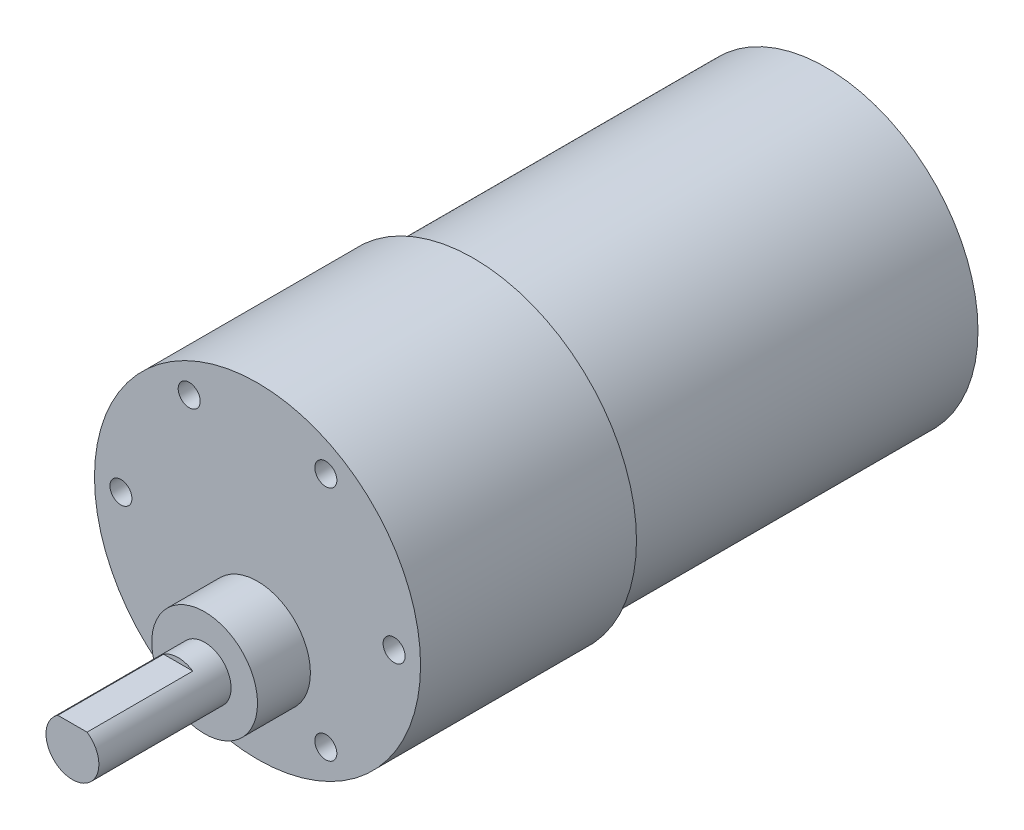
ISO-10303-21;
HEADER;
FILE_DESCRIPTION(('STEP AP214'),'2;1');
FILE_NAME('part.step','',(''),(''),'','','');
FILE_SCHEMA(('AUTOMOTIVE_DESIGN { 1 0 10303 214 1 1 1 1 }'));
ENDSEC;
DATA;
#1=APPLICATION_CONTEXT('core data for automotive mechanical design processes');
#2=APPLICATION_PROTOCOL_DEFINITION('international standard','automotive_design',2000,#1);
#3=PRODUCT_CONTEXT('',#1,'mechanical');
#4=PRODUCT('Part','Part','',(#3));
#5=PRODUCT_RELATED_PRODUCT_CATEGORY('part','',(#4));
#6=PRODUCT_DEFINITION_FORMATION('','',#4);
#7=PRODUCT_DEFINITION_CONTEXT('part definition',#1,'design');
#8=PRODUCT_DEFINITION('design','',#6,#7);
#9=PRODUCT_DEFINITION_SHAPE('','',#8);
#10=(LENGTH_UNIT() NAMED_UNIT(*) SI_UNIT(.MILLI.,.METRE.));
#11=(NAMED_UNIT(*) PLANE_ANGLE_UNIT() SI_UNIT($,.RADIAN.));
#12=(NAMED_UNIT(*) SI_UNIT($,.STERADIAN.) SOLID_ANGLE_UNIT());
#13=UNCERTAINTY_MEASURE_WITH_UNIT(LENGTH_MEASURE(1.E-05),#10,'distance_accuracy_value','');
#14=(GEOMETRIC_REPRESENTATION_CONTEXT(3) GLOBAL_UNCERTAINTY_ASSIGNED_CONTEXT((#13)) GLOBAL_UNIT_ASSIGNED_CONTEXT((#10,
#11,#12)) REPRESENTATION_CONTEXT('',''));
#15=CARTESIAN_POINT('',(0.,0.,0.));
#16=DIRECTION('',(0.,0.,1.));
#17=DIRECTION('',(1.,0.,0.));
#18=AXIS2_PLACEMENT_3D('',#15,#16,#17);
#19=CARTESIAN_POINT('',(0.,-7.,70.5));
#20=DIRECTION('',(0.,0.,1.));
#21=DIRECTION('',(1.,0.,0.));
#22=AXIS2_PLACEMENT_3D('',#19,#20,#21);
#23=PLANE('',#22);
#24=CARTESIAN_POINT('',(0.,-7.,70.5));
#25=DIRECTION('',(0.,0.,1.));
#26=DIRECTION('',(1.,0.,0.));
#27=AXIS2_PLACEMENT_3D('',#24,#25,#26);
#28=CIRCLE('',#27,6.);
#29=CARTESIAN_POINT('',(6.,-7.,70.5));
#30=VERTEX_POINT('',#29);
#31=EDGE_CURVE('E79',#30,#30,#28,.T.);
#32=ORIENTED_EDGE('',*,*,#31,.T.);
#33=EDGE_LOOP('',(#32));
#34=FACE_BOUND('',#33,.T.);
#35=CARTESIAN_POINT('',(0.,-7.,70.5));
#36=DIRECTION('',(0.,0.,1.));
#37=DIRECTION('',(1.,0.,0.));
#38=AXIS2_PLACEMENT_3D('',#35,#36,#37);
#39=CIRCLE('',#38,3.);
#40=CARTESIAN_POINT('',(3.,-7.,70.5));
#41=VERTEX_POINT('',#40);
#42=EDGE_CURVE('E76',#41,#41,#39,.T.);
#43=ORIENTED_EDGE('',*,*,#42,.F.);
#44=EDGE_LOOP('',(#43));
#45=FACE_BOUND('',#44,.T.);
#46=ADVANCED_FACE('F33',(#34,#45),#23,.T.);
#47=CARTESIAN_POINT('',(0.,0.,64.5));
#48=DIRECTION('',(0.,0.,1.));
#49=DIRECTION('',(1.,0.,0.));
#50=AXIS2_PLACEMENT_3D('',#47,#48,#49);
#51=PLANE('',#50);
#52=CARTESIAN_POINT('',(-7.75000000003913,-13.4233821174013,64.5));
#53=DIRECTION('',(0.,0.,1.));
#54=DIRECTION('',(1.,0.,0.));
#55=AXIS2_PLACEMENT_3D('',#52,#53,#54);
#56=CIRCLE('',#55,1.25000000000115);
#57=CARTESIAN_POINT('',(-6.50000000003798,-13.4233821174013,64.5));
#58=VERTEX_POINT('',#57);
#59=EDGE_CURVE('E332',#58,#58,#56,.T.);
#60=ORIENTED_EDGE('',*,*,#59,.F.);
#61=EDGE_LOOP('',(#60));
#62=FACE_BOUND('',#61,.T.);
#63=CARTESIAN_POINT('',(7.74999999996087,-13.4233821174013,64.5));
#64=DIRECTION('',(0.,0.,1.));
#65=DIRECTION('',(1.,0.,0.));
#66=AXIS2_PLACEMENT_3D('',#63,#64,#65);
#67=CIRCLE('',#66,1.25000000000114);
#68=CARTESIAN_POINT('',(8.99999999996202,-13.4233821174013,64.5));
#69=VERTEX_POINT('',#68);
#70=EDGE_CURVE('E331',#69,#69,#67,.T.);
#71=ORIENTED_EDGE('',*,*,#70,.F.);
#72=EDGE_LOOP('',(#71));
#73=FACE_BOUND('',#72,.T.);
#74=CARTESIAN_POINT('',(15.4999999999609,1.16412575138153E-05,64.5));
#75=DIRECTION('',(0.,0.,1.));
#76=DIRECTION('',(1.,0.,0.));
#77=AXIS2_PLACEMENT_3D('',#74,#75,#76);
#78=CIRCLE('',#77,1.25000000000115);
#79=CARTESIAN_POINT('',(16.749999999962,1.16412575138153E-05,64.5));
#80=VERTEX_POINT('',#79);
#81=EDGE_CURVE('E341',#80,#80,#78,.T.);
#82=ORIENTED_EDGE('',*,*,#81,.F.);
#83=EDGE_LOOP('',(#82));
#84=FACE_BOUND('',#83,.T.);
#85=CARTESIAN_POINT('',(7.74999999996086,13.4234053999163,64.5));
#86=DIRECTION('',(0.,0.,1.));
#87=DIRECTION('',(1.,0.,0.));
#88=AXIS2_PLACEMENT_3D('',#85,#86,#87);
#89=CIRCLE('',#88,1.25000000000115);
#90=CARTESIAN_POINT('',(8.99999999996201,13.4234053999163,64.5));
#91=VERTEX_POINT('',#90);
#92=EDGE_CURVE('E346',#91,#91,#89,.T.);
#93=ORIENTED_EDGE('',*,*,#92,.F.);
#94=EDGE_LOOP('',(#93));
#95=FACE_BOUND('',#94,.T.);
#96=CARTESIAN_POINT('',(-7.75000000003914,13.4234053999163,64.5));
#97=DIRECTION('',(0.,0.,1.));
#98=DIRECTION('',(1.,0.,0.));
#99=AXIS2_PLACEMENT_3D('',#96,#97,#98);
#100=CIRCLE('',#99,1.25000000000115);
#101=CARTESIAN_POINT('',(-6.50000000003799,13.4234053999163,64.5));
#102=VERTEX_POINT('',#101);
#103=EDGE_CURVE('E352',#102,#102,#100,.T.);
#104=ORIENTED_EDGE('',*,*,#103,.F.);
#105=EDGE_LOOP('',(#104));
#106=FACE_BOUND('',#105,.T.);
#107=CARTESIAN_POINT('',(-15.5000000000391,1.16412575118465E-05,64.5));
#108=DIRECTION('',(0.,0.,1.));
#109=DIRECTION('',(1.,0.,0.));
#110=AXIS2_PLACEMENT_3D('',#107,#108,#109);
#111=CIRCLE('',#110,1.25000000000115);
#112=CARTESIAN_POINT('',(-14.250000000038,1.16412575118465E-05,64.5));
#113=VERTEX_POINT('',#112);
#114=EDGE_CURVE('E358',#113,#113,#111,.T.);
#115=ORIENTED_EDGE('',*,*,#114,.F.);
#116=EDGE_LOOP('',(#115));
#117=FACE_BOUND('',#116,.T.);
#118=CARTESIAN_POINT('',(0.,0.,64.5));
#119=DIRECTION('',(0.,0.,1.));
#120=DIRECTION('',(1.,0.,0.));
#121=AXIS2_PLACEMENT_3D('',#118,#119,#120);
#122=CIRCLE('',#121,18.5);
#123=CARTESIAN_POINT('',(18.5,0.,64.5));
#124=VERTEX_POINT('',#123);
#125=EDGE_CURVE('E88',#124,#124,#122,.T.);
#126=ORIENTED_EDGE('',*,*,#125,.T.);
#127=EDGE_LOOP('',(#126));
#128=FACE_BOUND('',#127,.T.);
#129=CARTESIAN_POINT('',(0.,-7.,64.5));
#130=DIRECTION('',(0.,0.,1.));
#131=DIRECTION('',(1.,0.,0.));
#132=AXIS2_PLACEMENT_3D('',#129,#130,#131);
#133=CIRCLE('',#132,6.);
#134=CARTESIAN_POINT('',(6.,-7.,64.5));
#135=VERTEX_POINT('',#134);
#136=EDGE_CURVE('E75',#135,#135,#133,.T.);
#137=ORIENTED_EDGE('',*,*,#136,.F.);
#138=EDGE_LOOP('',(#137));
#139=FACE_BOUND('',#138,.T.);
#140=ADVANCED_FACE('F105',(#62,#73,#84,#95,#106,#117,#128,#139),#51,.T.);
#141=CARTESIAN_POINT('',(0.,0.,40.));
#142=DIRECTION('',(0.,0.,-1.));
#143=DIRECTION('',(-1.,0.,0.));
#144=AXIS2_PLACEMENT_3D('',#141,#142,#143);
#145=CYLINDRICAL_SURFACE('',#144,17.25);
#146=CARTESIAN_POINT('',(0.,0.,40.));
#147=DIRECTION('',(0.,0.,1.));
#148=DIRECTION('',(1.,0.,0.));
#149=AXIS2_PLACEMENT_3D('',#146,#147,#148);
#150=CIRCLE('',#149,17.25);
#151=CARTESIAN_POINT('',(17.25,0.,40.));
#152=VERTEX_POINT('',#151);
#153=EDGE_CURVE('E11',#152,#152,#150,.T.);
#154=ORIENTED_EDGE('',*,*,#153,.F.);
#155=EDGE_LOOP('',(#154));
#156=FACE_BOUND('',#155,.T.);
#157=CARTESIAN_POINT('',(0.,0.,0.));
#158=DIRECTION('',(0.,0.,1.));
#159=DIRECTION('',(1.,0.,0.));
#160=AXIS2_PLACEMENT_3D('',#157,#158,#159);
#161=CIRCLE('',#160,17.25);
#162=CARTESIAN_POINT('',(17.25,0.,0.));
#163=VERTEX_POINT('',#162);
#164=EDGE_CURVE('E37',#163,#163,#161,.T.);
#165=ORIENTED_EDGE('',*,*,#164,.T.);
#166=EDGE_LOOP('',(#165));
#167=FACE_BOUND('',#166,.T.);
#168=ADVANCED_FACE('F35',(#156,#167),#145,.T.);
#169=CARTESIAN_POINT('',(0.,0.,0.));
#170=DIRECTION('',(0.,0.,1.));
#171=DIRECTION('',(1.,0.,0.));
#172=AXIS2_PLACEMENT_3D('',#169,#170,#171);
#173=PLANE('',#172);
#174=ORIENTED_EDGE('',*,*,#164,.F.);
#175=EDGE_LOOP('',(#174));
#176=FACE_BOUND('',#175,.T.);
#177=ADVANCED_FACE('F99',(#176),#173,.F.);
#178=CARTESIAN_POINT('',(0.,0.,40.));
#179=DIRECTION('',(0.,0.,1.));
#180=DIRECTION('',(1.,0.,0.));
#181=AXIS2_PLACEMENT_3D('',#178,#179,#180);
#182=PLANE('',#181);
#183=CARTESIAN_POINT('',(0.,0.,40.));
#184=DIRECTION('',(0.,0.,1.));
#185=DIRECTION('',(1.,0.,0.));
#186=AXIS2_PLACEMENT_3D('',#183,#184,#185);
#187=CIRCLE('',#186,18.5);
#188=CARTESIAN_POINT('',(18.5,0.,40.));
#189=VERTEX_POINT('',#188);
#190=EDGE_CURVE('E86',#189,#189,#187,.T.);
#191=ORIENTED_EDGE('',*,*,#190,.F.);
#192=EDGE_LOOP('',(#191));
#193=FACE_BOUND('',#192,.T.);
#194=ORIENTED_EDGE('',*,*,#153,.T.);
#195=EDGE_LOOP('',(#194));
#196=FACE_BOUND('',#195,.T.);
#197=ADVANCED_FACE('F96',(#193,#196),#182,.F.);
#198=CARTESIAN_POINT('',(0.,0.,64.5));
#199=DIRECTION('',(0.,0.,-1.));
#200=DIRECTION('',(-1.,0.,0.));
#201=AXIS2_PLACEMENT_3D('',#198,#199,#200);
#202=CYLINDRICAL_SURFACE('',#201,18.5);
#203=ORIENTED_EDGE('',*,*,#125,.F.);
#204=EDGE_LOOP('',(#203));
#205=FACE_BOUND('',#204,.T.);
#206=ORIENTED_EDGE('',*,*,#190,.T.);
#207=EDGE_LOOP('',(#206));
#208=FACE_BOUND('',#207,.T.);
#209=ADVANCED_FACE('F94',(#205,#208),#202,.T.);
#210=CARTESIAN_POINT('',(0.,-7.,70.5));
#211=DIRECTION('',(0.,0.,-1.));
#212=DIRECTION('',(-1.,0.,0.));
#213=AXIS2_PLACEMENT_3D('',#210,#211,#212);
#214=CYLINDRICAL_SURFACE('',#213,6.);
#215=ORIENTED_EDGE('',*,*,#31,.F.);
#216=EDGE_LOOP('',(#215));
#217=FACE_BOUND('',#216,.T.);
#218=ORIENTED_EDGE('',*,*,#136,.T.);
#219=EDGE_LOOP('',(#218));
#220=FACE_BOUND('',#219,.T.);
#221=ADVANCED_FACE('F126',(#217,#220),#214,.T.);
#222=CARTESIAN_POINT('',(0.,-7.,85.5));
#223=DIRECTION('',(0.,0.,-1.));
#224=DIRECTION('',(-1.,0.,0.));
#225=AXIS2_PLACEMENT_3D('',#222,#223,#224);
#226=CYLINDRICAL_SURFACE('',#225,3.);
#227=CARTESIAN_POINT('',(0.,-7.,85.5));
#228=DIRECTION('',(0.,0.,1.));
#229=DIRECTION('',(1.,0.,0.));
#230=AXIS2_PLACEMENT_3D('',#227,#228,#229);
#231=CIRCLE('',#230,3.);
#232=CARTESIAN_POINT('',(-1.6583123951777,-4.5,85.5));
#233=VERTEX_POINT('',#232);
#234=CARTESIAN_POINT('',(1.6583123951777,-4.5,85.5));
#235=VERTEX_POINT('',#234);
#236=EDGE_CURVE('E71',#233,#235,#231,.T.);
#237=ORIENTED_EDGE('',*,*,#236,.F.);
#238=DIRECTION('',(0.,0.,1.));
#239=VECTOR('',#238,1.);
#240=CARTESIAN_POINT('',(-1.6583123951777,-4.5,73.5));
#241=LINE('',#240,#239);
#242=CARTESIAN_POINT('',(-1.6583123951777,-4.5,73.5));
#243=VERTEX_POINT('',#242);
#244=EDGE_CURVE('E48',#243,#233,#241,.T.);
#245=ORIENTED_EDGE('',*,*,#244,.F.);
#246=CARTESIAN_POINT('',(0.,-7.,73.5));
#247=DIRECTION('',(0.,0.,1.));
#248=DIRECTION('',(1.,0.,0.));
#249=AXIS2_PLACEMENT_3D('',#246,#247,#248);
#250=CIRCLE('',#249,3.);
#251=CARTESIAN_POINT('',(1.6583123951777,-4.5,73.5));
#252=VERTEX_POINT('',#251);
#253=EDGE_CURVE('E72',#252,#243,#250,.T.);
#254=ORIENTED_EDGE('',*,*,#253,.F.);
#255=DIRECTION('',(0.,0.,1.));
#256=VECTOR('',#255,1.);
#257=CARTESIAN_POINT('',(1.6583123951777,-4.5,73.5));
#258=LINE('',#257,#256);
#259=EDGE_CURVE('E61',#252,#235,#258,.T.);
#260=ORIENTED_EDGE('',*,*,#259,.T.);
#261=EDGE_LOOP('',(#237,#245,#254,#260));
#262=FACE_BOUND('',#261,.T.);
#263=ORIENTED_EDGE('',*,*,#42,.T.);
#264=EDGE_LOOP('',(#263));
#265=FACE_BOUND('',#264,.T.);
#266=ADVANCED_FACE('F69',(#262,#265),#226,.T.);
#267=CARTESIAN_POINT('',(0.,-7.,85.5));
#268=DIRECTION('',(0.,0.,1.));
#269=DIRECTION('',(1.,0.,0.));
#270=AXIS2_PLACEMENT_3D('',#267,#268,#269);
#271=PLANE('',#270);
#272=DIRECTION('',(1.,0.,0.));
#273=VECTOR('',#272,1.);
#274=CARTESIAN_POINT('',(0.,-4.5,85.5));
#275=LINE('',#274,#273);
#276=EDGE_CURVE('E58',#233,#235,#275,.T.);
#277=ORIENTED_EDGE('',*,*,#276,.F.);
#278=ORIENTED_EDGE('',*,*,#236,.T.);
#279=EDGE_LOOP('',(#277,#278));
#280=FACE_BOUND('',#279,.T.);
#281=ADVANCED_FACE('F74',(#280),#271,.T.);
#282=CARTESIAN_POINT('',(0.,-4.5,73.5));
#283=DIRECTION('',(0.,-1.,0.));
#284=DIRECTION('',(0.,0.,-1.));
#285=AXIS2_PLACEMENT_3D('',#282,#283,#284);
#286=PLANE('',#285);
#287=ORIENTED_EDGE('',*,*,#276,.T.);
#288=ORIENTED_EDGE('',*,*,#259,.F.);
#289=DIRECTION('',(1.,0.,0.));
#290=VECTOR('',#289,1.);
#291=CARTESIAN_POINT('',(0.,-4.5,73.5));
#292=LINE('',#291,#290);
#293=EDGE_CURVE('E54',#243,#252,#292,.T.);
#294=ORIENTED_EDGE('',*,*,#293,.F.);
#295=ORIENTED_EDGE('',*,*,#244,.T.);
#296=EDGE_LOOP('',(#287,#288,#294,#295));
#297=FACE_BOUND('',#296,.T.);
#298=ADVANCED_FACE('F60',(#297),#286,.F.);
#299=CARTESIAN_POINT('',(0.,-7.,73.5));
#300=DIRECTION('',(0.,0.,1.));
#301=DIRECTION('',(1.,0.,0.));
#302=AXIS2_PLACEMENT_3D('',#299,#300,#301);
#303=PLANE('',#302);
#304=ORIENTED_EDGE('',*,*,#293,.T.);
#305=ORIENTED_EDGE('',*,*,#253,.T.);
#306=EDGE_LOOP('',(#304,#305));
#307=FACE_BOUND('',#306,.T.);
#308=ADVANCED_FACE('F160',(#307),#303,.T.);
#309=CARTESIAN_POINT('',(-15.5000000000391,1.16412575118465E-05,59.5));
#310=DIRECTION('',(0.,0.,1.));
#311=DIRECTION('',(1.,0.,0.));
#312=AXIS2_PLACEMENT_3D('',#309,#310,#311);
#313=CYLINDRICAL_SURFACE('',#312,1.25000000000115);
#314=CARTESIAN_POINT('',(-15.5000000000391,1.16412575118465E-05,59.5));
#315=DIRECTION('',(0.,0.,1.));
#316=DIRECTION('',(1.,0.,0.));
#317=AXIS2_PLACEMENT_3D('',#314,#315,#316);
#318=CIRCLE('',#317,1.25000000000115);
#319=CARTESIAN_POINT('',(-14.250000000038,1.16412575118465E-05,59.5));
#320=VERTEX_POINT('',#319);
#321=EDGE_CURVE('E66',#320,#320,#318,.T.);
#322=ORIENTED_EDGE('',*,*,#321,.F.);
#323=EDGE_LOOP('',(#322));
#324=FACE_BOUND('',#323,.T.);
#325=ORIENTED_EDGE('',*,*,#114,.T.);
#326=EDGE_LOOP('',(#325));
#327=FACE_BOUND('',#326,.T.);
#328=ADVANCED_FACE('F167',(#324,#327),#313,.F.);
#329=CARTESIAN_POINT('',(-15.5000000000391,1.16412575118465E-05,59.5));
#330=DIRECTION('',(0.,0.,1.));
#331=DIRECTION('',(1.,0.,0.));
#332=AXIS2_PLACEMENT_3D('',#329,#330,#331);
#333=PLANE('',#332);
#334=ORIENTED_EDGE('',*,*,#321,.T.);
#335=EDGE_LOOP('',(#334));
#336=FACE_BOUND('',#335,.T.);
#337=ADVANCED_FACE('F175',(#336),#333,.T.);
#338=CARTESIAN_POINT('',(-7.75000000003914,13.4234053999163,59.5));
#339=DIRECTION('',(0.,0.,1.));
#340=DIRECTION('',(1.,0.,0.));
#341=AXIS2_PLACEMENT_3D('',#338,#339,#340);
#342=CYLINDRICAL_SURFACE('',#341,1.25000000000115);
#343=CARTESIAN_POINT('',(-7.75000000003914,13.4234053999163,59.5));
#344=DIRECTION('',(0.,0.,1.));
#345=DIRECTION('',(1.,0.,0.));
#346=AXIS2_PLACEMENT_3D('',#343,#344,#345);
#347=CIRCLE('',#346,1.25000000000115);
#348=CARTESIAN_POINT('',(-6.50000000003799,13.4234053999163,59.5));
#349=VERTEX_POINT('',#348);
#350=EDGE_CURVE('E355',#349,#349,#347,.T.);
#351=ORIENTED_EDGE('',*,*,#350,.F.);
#352=EDGE_LOOP('',(#351));
#353=FACE_BOUND('',#352,.T.);
#354=ORIENTED_EDGE('',*,*,#103,.T.);
#355=EDGE_LOOP('',(#354));
#356=FACE_BOUND('',#355,.T.);
#357=ADVANCED_FACE('F183',(#353,#356),#342,.F.);
#358=CARTESIAN_POINT('',(-7.75000000003914,13.4234053999163,59.5));
#359=DIRECTION('',(0.,0.,1.));
#360=DIRECTION('',(1.,0.,0.));
#361=AXIS2_PLACEMENT_3D('',#358,#359,#360);
#362=PLANE('',#361);
#363=ORIENTED_EDGE('',*,*,#350,.T.);
#364=EDGE_LOOP('',(#363));
#365=FACE_BOUND('',#364,.T.);
#366=ADVANCED_FACE('F191',(#365),#362,.T.);
#367=CARTESIAN_POINT('',(7.74999999996086,13.4234053999163,59.5));
#368=DIRECTION('',(0.,0.,1.));
#369=DIRECTION('',(1.,0.,0.));
#370=AXIS2_PLACEMENT_3D('',#367,#368,#369);
#371=CYLINDRICAL_SURFACE('',#370,1.25000000000115);
#372=CARTESIAN_POINT('',(7.74999999996086,13.4234053999163,59.5));
#373=DIRECTION('',(0.,0.,1.));
#374=DIRECTION('',(1.,0.,0.));
#375=AXIS2_PLACEMENT_3D('',#372,#373,#374);
#376=CIRCLE('',#375,1.25000000000115);
#377=CARTESIAN_POINT('',(8.99999999996201,13.4234053999163,59.5));
#378=VERTEX_POINT('',#377);
#379=EDGE_CURVE('E349',#378,#378,#376,.T.);
#380=ORIENTED_EDGE('',*,*,#379,.F.);
#381=EDGE_LOOP('',(#380));
#382=FACE_BOUND('',#381,.T.);
#383=ORIENTED_EDGE('',*,*,#92,.T.);
#384=EDGE_LOOP('',(#383));
#385=FACE_BOUND('',#384,.T.);
#386=ADVANCED_FACE('F199',(#382,#385),#371,.F.);
#387=CARTESIAN_POINT('',(7.74999999996086,13.4234053999163,59.5));
#388=DIRECTION('',(0.,0.,1.));
#389=DIRECTION('',(1.,0.,0.));
#390=AXIS2_PLACEMENT_3D('',#387,#388,#389);
#391=PLANE('',#390);
#392=ORIENTED_EDGE('',*,*,#379,.T.);
#393=EDGE_LOOP('',(#392));
#394=FACE_BOUND('',#393,.T.);
#395=ADVANCED_FACE('F207',(#394),#391,.T.);
#396=CARTESIAN_POINT('',(15.4999999999609,1.16412575138153E-05,59.5));
#397=DIRECTION('',(0.,0.,1.));
#398=DIRECTION('',(1.,0.,0.));
#399=AXIS2_PLACEMENT_3D('',#396,#397,#398);
#400=CYLINDRICAL_SURFACE('',#399,1.25000000000115);
#401=CARTESIAN_POINT('',(15.4999999999609,1.16412575138153E-05,59.5));
#402=DIRECTION('',(0.,0.,1.));
#403=DIRECTION('',(1.,0.,0.));
#404=AXIS2_PLACEMENT_3D('',#401,#402,#403);
#405=CIRCLE('',#404,1.25000000000115);
#406=CARTESIAN_POINT('',(16.749999999962,1.16412575138153E-05,59.5));
#407=VERTEX_POINT('',#406);
#408=EDGE_CURVE('E343',#407,#407,#405,.T.);
#409=ORIENTED_EDGE('',*,*,#408,.F.);
#410=EDGE_LOOP('',(#409));
#411=FACE_BOUND('',#410,.T.);
#412=ORIENTED_EDGE('',*,*,#81,.T.);
#413=EDGE_LOOP('',(#412));
#414=FACE_BOUND('',#413,.T.);
#415=ADVANCED_FACE('F215',(#411,#414),#400,.F.);
#416=CARTESIAN_POINT('',(15.4999999999609,1.16412575138153E-05,59.5));
#417=DIRECTION('',(0.,0.,1.));
#418=DIRECTION('',(1.,0.,0.));
#419=AXIS2_PLACEMENT_3D('',#416,#417,#418);
#420=PLANE('',#419);
#421=ORIENTED_EDGE('',*,*,#408,.T.);
#422=EDGE_LOOP('',(#421));
#423=FACE_BOUND('',#422,.T.);
#424=ADVANCED_FACE('F223',(#423),#420,.T.);
#425=CARTESIAN_POINT('',(7.74999999996087,-13.4233821174013,59.5));
#426=DIRECTION('',(0.,0.,1.));
#427=DIRECTION('',(1.,0.,0.));
#428=AXIS2_PLACEMENT_3D('',#425,#426,#427);
#429=CYLINDRICAL_SURFACE('',#428,1.25000000000114);
#430=CARTESIAN_POINT('',(7.74999999996087,-13.4233821174013,59.5));
#431=DIRECTION('',(0.,0.,1.));
#432=DIRECTION('',(1.,0.,0.));
#433=AXIS2_PLACEMENT_3D('',#430,#431,#432);
#434=CIRCLE('',#433,1.25000000000114);
#435=CARTESIAN_POINT('',(8.99999999996202,-13.4233821174013,59.5));
#436=VERTEX_POINT('',#435);
#437=EDGE_CURVE('E335',#436,#436,#434,.T.);
#438=ORIENTED_EDGE('',*,*,#437,.F.);
#439=EDGE_LOOP('',(#438));
#440=FACE_BOUND('',#439,.T.);
#441=ORIENTED_EDGE('',*,*,#70,.T.);
#442=EDGE_LOOP('',(#441));
#443=FACE_BOUND('',#442,.T.);
#444=ADVANCED_FACE('F231',(#440,#443),#429,.F.);
#445=CARTESIAN_POINT('',(7.74999999996087,-13.4233821174013,59.5));
#446=DIRECTION('',(0.,0.,1.));
#447=DIRECTION('',(1.,0.,0.));
#448=AXIS2_PLACEMENT_3D('',#445,#446,#447);
#449=PLANE('',#448);
#450=ORIENTED_EDGE('',*,*,#437,.T.);
#451=EDGE_LOOP('',(#450));
#452=FACE_BOUND('',#451,.T.);
#453=ADVANCED_FACE('F239',(#452),#449,.T.);
#454=CARTESIAN_POINT('',(-7.75000000003913,-13.4233821174013,59.5));
#455=DIRECTION('',(0.,0.,1.));
#456=DIRECTION('',(1.,0.,0.));
#457=AXIS2_PLACEMENT_3D('',#454,#455,#456);
#458=CYLINDRICAL_SURFACE('',#457,1.25000000000115);
#459=CARTESIAN_POINT('',(-7.75000000003913,-13.4233821174013,59.5));
#460=DIRECTION('',(0.,0.,1.));
#461=DIRECTION('',(1.,0.,0.));
#462=AXIS2_PLACEMENT_3D('',#459,#460,#461);
#463=CIRCLE('',#462,1.25000000000115);
#464=CARTESIAN_POINT('',(-6.50000000003798,-13.4233821174013,59.5));
#465=VERTEX_POINT('',#464);
#466=EDGE_CURVE('E330',#465,#465,#463,.T.);
#467=ORIENTED_EDGE('',*,*,#466,.F.);
#468=EDGE_LOOP('',(#467));
#469=FACE_BOUND('',#468,.T.);
#470=ORIENTED_EDGE('',*,*,#59,.T.);
#471=EDGE_LOOP('',(#470));
#472=FACE_BOUND('',#471,.T.);
#473=ADVANCED_FACE('F247',(#469,#472),#458,.F.);
#474=CARTESIAN_POINT('',(-7.75000000003913,-13.4233821174013,59.5));
#475=DIRECTION('',(0.,0.,1.));
#476=DIRECTION('',(1.,0.,0.));
#477=AXIS2_PLACEMENT_3D('',#474,#475,#476);
#478=PLANE('',#477);
#479=ORIENTED_EDGE('',*,*,#466,.T.);
#480=EDGE_LOOP('',(#479));
#481=FACE_BOUND('',#480,.T.);
#482=ADVANCED_FACE('F255',(#481),#478,.T.);
#483=CLOSED_SHELL('',(#46,#140,#168,#177,#197,#209,#221,#266,#281,#298,#308,#328,#337,#357,#366,
#386,#395,#415,#424,#444,#453,#473,#482));
#484=MANIFOLD_SOLID_BREP('B2',#483);
#485=ADVANCED_BREP_SHAPE_REPRESENTATION('',(#18,#484),#14);
#486=SHAPE_DEFINITION_REPRESENTATION(#9,#485);
ENDSEC;
END-ISO-10303-21;
